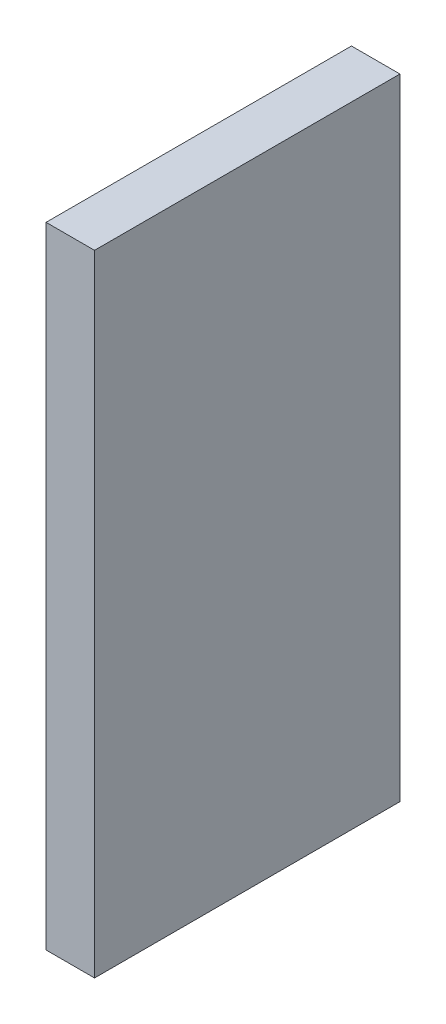
ISO-10303-21;
HEADER;
FILE_DESCRIPTION(('STEP AP214'),'2;1');
FILE_NAME('part.step','',(''),(''),'','','');
FILE_SCHEMA(('AUTOMOTIVE_DESIGN { 1 0 10303 214 1 1 1 1 }'));
ENDSEC;
DATA;
#1=APPLICATION_CONTEXT('core data for automotive mechanical design processes');
#2=APPLICATION_PROTOCOL_DEFINITION('international standard','automotive_design',2000,#1);
#3=PRODUCT_CONTEXT('',#1,'mechanical');
#4=PRODUCT('Part','Part','',(#3));
#5=PRODUCT_RELATED_PRODUCT_CATEGORY('part','',(#4));
#6=PRODUCT_DEFINITION_FORMATION('','',#4);
#7=PRODUCT_DEFINITION_CONTEXT('part definition',#1,'design');
#8=PRODUCT_DEFINITION('design','',#6,#7);
#9=PRODUCT_DEFINITION_SHAPE('','',#8);
#10=(LENGTH_UNIT() NAMED_UNIT(*) SI_UNIT(.MILLI.,.METRE.));
#11=(NAMED_UNIT(*) PLANE_ANGLE_UNIT() SI_UNIT($,.RADIAN.));
#12=(NAMED_UNIT(*) SI_UNIT($,.STERADIAN.) SOLID_ANGLE_UNIT());
#13=UNCERTAINTY_MEASURE_WITH_UNIT(LENGTH_MEASURE(1.E-05),#10,'distance_accuracy_value','');
#14=(GEOMETRIC_REPRESENTATION_CONTEXT(3) GLOBAL_UNCERTAINTY_ASSIGNED_CONTEXT((#13)) GLOBAL_UNIT_ASSIGNED_CONTEXT((#10,
#11,#12)) REPRESENTATION_CONTEXT('',''));
#15=CARTESIAN_POINT('',(0.,0.,0.));
#16=DIRECTION('',(0.,0.,1.));
#17=DIRECTION('',(1.,0.,0.));
#18=AXIS2_PLACEMENT_3D('',#15,#16,#17);
#19=CARTESIAN_POINT('',(-10.,0.,0.));
#20=DIRECTION('',(-1.,0.,0.));
#21=DIRECTION('',(0.,0.,1.));
#22=AXIS2_PLACEMENT_3D('',#19,#20,#21);
#23=PLANE('',#22);
#24=DIRECTION('',(0.,1.,0.));
#25=VECTOR('',#24,1.);
#26=CARTESIAN_POINT('',(-10.,-130.,63.));
#27=LINE('',#26,#25);
#28=CARTESIAN_POINT('',(-10.,-130.,63.));
#29=VERTEX_POINT('',#28);
#30=CARTESIAN_POINT('',(-10.,130.,63.));
#31=VERTEX_POINT('',#30);
#32=EDGE_CURVE('E54',#29,#31,#27,.T.);
#33=ORIENTED_EDGE('',*,*,#32,.T.);
#34=DIRECTION('',(0.,0.,-1.));
#35=VECTOR('',#34,1.);
#36=CARTESIAN_POINT('',(-10.,130.,63.));
#37=LINE('',#36,#35);
#38=CARTESIAN_POINT('',(-10.,130.,-63.));
#39=VERTEX_POINT('',#38);
#40=EDGE_CURVE('E75',#31,#39,#37,.T.);
#41=ORIENTED_EDGE('',*,*,#40,.T.);
#42=DIRECTION('',(0.,1.,0.));
#43=VECTOR('',#42,1.);
#44=CARTESIAN_POINT('',(-10.,-130.,-63.));
#45=LINE('',#44,#43);
#46=CARTESIAN_POINT('',(-10.,-130.,-63.));
#47=VERTEX_POINT('',#46);
#48=EDGE_CURVE('E57',#39,#47,#45,.F.);
#49=ORIENTED_EDGE('',*,*,#48,.T.);
#50=DIRECTION('',(0.,0.,1.));
#51=VECTOR('',#50,1.);
#52=CARTESIAN_POINT('',(-10.,-130.,63.));
#53=LINE('',#52,#51);
#54=EDGE_CURVE('E19',#47,#29,#53,.T.);
#55=ORIENTED_EDGE('',*,*,#54,.T.);
#56=EDGE_LOOP('',(#33,#41,#49,#55));
#57=FACE_BOUND('',#56,.T.);
#58=ADVANCED_FACE('F16',(#57),#23,.T.);
#59=CARTESIAN_POINT('',(10.,-130.,63.));
#60=DIRECTION('',(0.,1.,0.));
#61=DIRECTION('',(0.,0.,1.));
#62=AXIS2_PLACEMENT_3D('',#59,#60,#61);
#63=PLANE('',#62);
#64=DIRECTION('',(1.,0.,0.));
#65=VECTOR('',#64,1.);
#66=CARTESIAN_POINT('',(10.,-130.,-63.));
#67=LINE('',#66,#65);
#68=CARTESIAN_POINT('',(10.,-130.,-63.));
#69=VERTEX_POINT('',#68);
#70=EDGE_CURVE('E77',#47,#69,#67,.T.);
#71=ORIENTED_EDGE('',*,*,#70,.T.);
#72=DIRECTION('',(0.,0.,1.));
#73=VECTOR('',#72,1.);
#74=CARTESIAN_POINT('',(10.,-130.,0.));
#75=LINE('',#74,#73);
#76=CARTESIAN_POINT('',(10.,-130.,63.));
#77=VERTEX_POINT('',#76);
#78=EDGE_CURVE('E72',#69,#77,#75,.T.);
#79=ORIENTED_EDGE('',*,*,#78,.T.);
#80=DIRECTION('',(-1.,0.,0.));
#81=VECTOR('',#80,1.);
#82=CARTESIAN_POINT('',(10.,-130.,63.));
#83=LINE('',#82,#81);
#84=EDGE_CURVE('E62',#77,#29,#83,.T.);
#85=ORIENTED_EDGE('',*,*,#84,.T.);
#86=ORIENTED_EDGE('',*,*,#54,.F.);
#87=EDGE_LOOP('',(#71,#79,#85,#86));
#88=FACE_BOUND('',#87,.T.);
#89=ADVANCED_FACE('F71',(#88),#63,.F.);
#90=CARTESIAN_POINT('',(10.,-130.,63.));
#91=DIRECTION('',(0.,0.,-1.));
#92=DIRECTION('',(-1.,0.,0.));
#93=AXIS2_PLACEMENT_3D('',#90,#91,#92);
#94=PLANE('',#93);
#95=ORIENTED_EDGE('',*,*,#84,.F.);
#96=DIRECTION('',(0.,1.,0.));
#97=VECTOR('',#96,1.);
#98=CARTESIAN_POINT('',(10.,0.,63.));
#99=LINE('',#98,#97);
#100=CARTESIAN_POINT('',(10.,130.,63.));
#101=VERTEX_POINT('',#100);
#102=EDGE_CURVE('E82',#77,#101,#99,.T.);
#103=ORIENTED_EDGE('',*,*,#102,.T.);
#104=DIRECTION('',(1.,0.,0.));
#105=VECTOR('',#104,1.);
#106=CARTESIAN_POINT('',(10.,130.,63.));
#107=LINE('',#106,#105);
#108=EDGE_CURVE('E68',#101,#31,#107,.F.);
#109=ORIENTED_EDGE('',*,*,#108,.T.);
#110=ORIENTED_EDGE('',*,*,#32,.F.);
#111=EDGE_LOOP('',(#95,#103,#109,#110));
#112=FACE_BOUND('',#111,.T.);
#113=ADVANCED_FACE('F65',(#112),#94,.F.);
#114=CARTESIAN_POINT('',(10.,130.,63.));
#115=DIRECTION('',(0.,-1.,0.));
#116=DIRECTION('',(0.,0.,-1.));
#117=AXIS2_PLACEMENT_3D('',#114,#115,#116);
#118=PLANE('',#117);
#119=ORIENTED_EDGE('',*,*,#108,.F.);
#120=DIRECTION('',(0.,0.,1.));
#121=VECTOR('',#120,1.);
#122=CARTESIAN_POINT('',(10.,130.,0.));
#123=LINE('',#122,#121);
#124=CARTESIAN_POINT('',(10.,130.,-63.));
#125=VERTEX_POINT('',#124);
#126=EDGE_CURVE('E25',#101,#125,#123,.F.);
#127=ORIENTED_EDGE('',*,*,#126,.T.);
#128=DIRECTION('',(1.,0.,0.));
#129=VECTOR('',#128,1.);
#130=CARTESIAN_POINT('',(10.,130.,-63.));
#131=LINE('',#130,#129);
#132=EDGE_CURVE('E33',#125,#39,#131,.F.);
#133=ORIENTED_EDGE('',*,*,#132,.T.);
#134=ORIENTED_EDGE('',*,*,#40,.F.);
#135=EDGE_LOOP('',(#119,#127,#133,#134));
#136=FACE_BOUND('',#135,.T.);
#137=ADVANCED_FACE('F87',(#136),#118,.F.);
#138=CARTESIAN_POINT('',(10.,-130.,-63.));
#139=DIRECTION('',(0.,0.,1.));
#140=DIRECTION('',(1.,0.,0.));
#141=AXIS2_PLACEMENT_3D('',#138,#139,#140);
#142=PLANE('',#141);
#143=ORIENTED_EDGE('',*,*,#132,.F.);
#144=DIRECTION('',(0.,1.,0.));
#145=VECTOR('',#144,1.);
#146=CARTESIAN_POINT('',(10.,0.,-63.));
#147=LINE('',#146,#145);
#148=EDGE_CURVE('E11',#125,#69,#147,.F.);
#149=ORIENTED_EDGE('',*,*,#148,.T.);
#150=ORIENTED_EDGE('',*,*,#70,.F.);
#151=ORIENTED_EDGE('',*,*,#48,.F.);
#152=EDGE_LOOP('',(#143,#149,#150,#151));
#153=FACE_BOUND('',#152,.T.);
#154=ADVANCED_FACE('F90',(#153),#142,.F.);
#155=CARTESIAN_POINT('',(10.,0.,0.));
#156=DIRECTION('',(-1.,0.,0.));
#157=DIRECTION('',(0.,0.,1.));
#158=AXIS2_PLACEMENT_3D('',#155,#156,#157);
#159=PLANE('',#158);
#160=ORIENTED_EDGE('',*,*,#126,.F.);
#161=ORIENTED_EDGE('',*,*,#102,.F.);
#162=ORIENTED_EDGE('',*,*,#78,.F.);
#163=ORIENTED_EDGE('',*,*,#148,.F.);
#164=EDGE_LOOP('',(#160,#161,#162,#163));
#165=FACE_BOUND('',#164,.T.);
#166=ADVANCED_FACE('F89',(#165),#159,.F.);
#167=CLOSED_SHELL('',(#58,#89,#113,#137,#154,#166));
#168=MANIFOLD_SOLID_BREP('B1',#167);
#169=ADVANCED_BREP_SHAPE_REPRESENTATION('',(#18,#168),#14);
#170=SHAPE_DEFINITION_REPRESENTATION(#9,#169);
ENDSEC;
END-ISO-10303-21;
